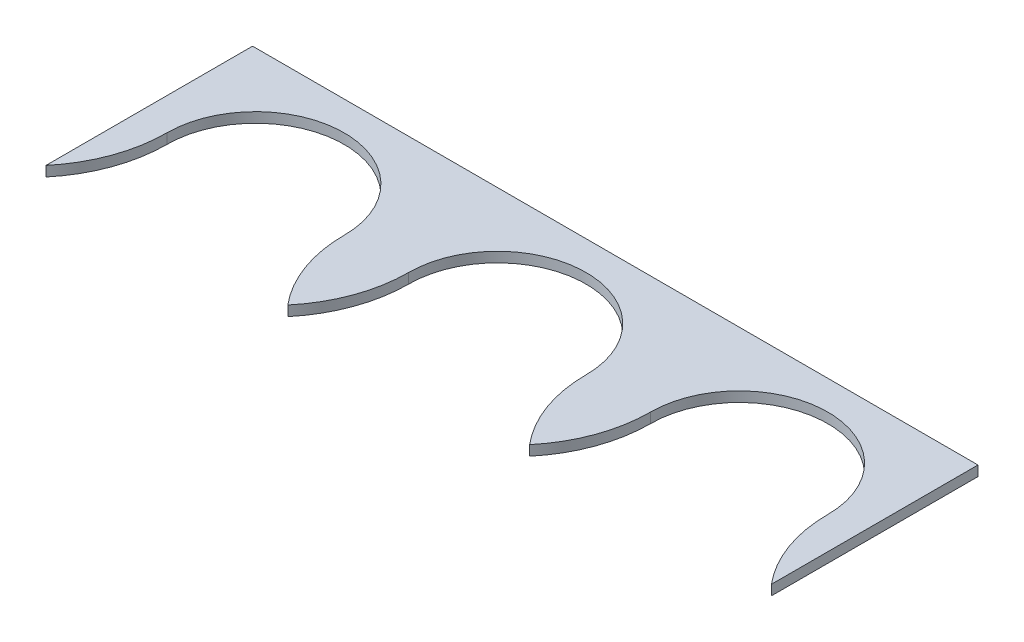
ISO-10303-21;
HEADER;
FILE_DESCRIPTION(('STEP AP214'),'2;1');
FILE_NAME('part.step','',(''),(''),'','','');
FILE_SCHEMA(('AUTOMOTIVE_DESIGN { 1 0 10303 214 1 1 1 1 }'));
ENDSEC;
DATA;
#1=APPLICATION_CONTEXT('core data for automotive mechanical design processes');
#2=APPLICATION_PROTOCOL_DEFINITION('international standard','automotive_design',2000,#1);
#3=PRODUCT_CONTEXT('',#1,'mechanical');
#4=PRODUCT('Part','Part','',(#3));
#5=PRODUCT_RELATED_PRODUCT_CATEGORY('part','',(#4));
#6=PRODUCT_DEFINITION_FORMATION('','',#4);
#7=PRODUCT_DEFINITION_CONTEXT('part definition',#1,'design');
#8=PRODUCT_DEFINITION('design','',#6,#7);
#9=PRODUCT_DEFINITION_SHAPE('','',#8);
#10=(LENGTH_UNIT() NAMED_UNIT(*) SI_UNIT(.MILLI.,.METRE.));
#11=(NAMED_UNIT(*) PLANE_ANGLE_UNIT() SI_UNIT($,.RADIAN.));
#12=(NAMED_UNIT(*) SI_UNIT($,.STERADIAN.) SOLID_ANGLE_UNIT());
#13=UNCERTAINTY_MEASURE_WITH_UNIT(LENGTH_MEASURE(1.E-05),#10,'distance_accuracy_value','');
#14=(GEOMETRIC_REPRESENTATION_CONTEXT(3) GLOBAL_UNCERTAINTY_ASSIGNED_CONTEXT((#13)) GLOBAL_UNIT_ASSIGNED_CONTEXT((#10,
#11,#12)) REPRESENTATION_CONTEXT('',''));
#15=CARTESIAN_POINT('',(0.,0.,0.));
#16=DIRECTION('',(0.,0.,1.));
#17=DIRECTION('',(1.,0.,0.));
#18=AXIS2_PLACEMENT_3D('',#15,#16,#17);
#19=CARTESIAN_POINT('',(76.2,-6.35,74.295));
#20=DIRECTION('',(0.,1.,0.));
#21=DIRECTION('',(0.,0.,1.));
#22=AXIS2_PLACEMENT_3D('',#19,#20,#21);
#23=CYLINDRICAL_SURFACE('',#22,55.88);
#24=CARTESIAN_POINT('',(76.2,0.,74.295));
#25=DIRECTION('',(0.,1.,0.));
#26=DIRECTION('',(0.,0.,1.));
#27=AXIS2_PLACEMENT_3D('',#24,#25,#26);
#28=CIRCLE('',#27,55.88);
#29=CARTESIAN_POINT('',(132.08,0.,74.295));
#30=VERTEX_POINT('',#29);
#31=CARTESIAN_POINT('',(20.32,0.,74.2949999999999));
#32=VERTEX_POINT('',#31);
#33=EDGE_CURVE('E153',#30,#32,#28,.T.);
#34=ORIENTED_EDGE('',*,*,#33,.T.);
#35=DIRECTION('',(0.,1.,0.));
#36=VECTOR('',#35,1.);
#37=CARTESIAN_POINT('',(20.32,-6.35,74.2949999999999));
#38=LINE('',#37,#36);
#39=CARTESIAN_POINT('',(20.32,-6.35,74.2949999999999));
#40=VERTEX_POINT('',#39);
#41=EDGE_CURVE('E11',#40,#32,#38,.T.);
#42=ORIENTED_EDGE('',*,*,#41,.F.);
#43=CARTESIAN_POINT('',(76.2,-6.35,74.295));
#44=DIRECTION('',(0.,1.,0.));
#45=DIRECTION('',(0.,0.,1.));
#46=AXIS2_PLACEMENT_3D('',#43,#44,#45);
#47=CIRCLE('',#46,55.88);
#48=CARTESIAN_POINT('',(132.08,-6.35,74.295));
#49=VERTEX_POINT('',#48);
#50=EDGE_CURVE('E53',#49,#40,#47,.T.);
#51=ORIENTED_EDGE('',*,*,#50,.F.);
#52=DIRECTION('',(0.,1.,0.));
#53=VECTOR('',#52,1.);
#54=CARTESIAN_POINT('',(132.08,-6.35,74.295));
#55=LINE('',#54,#53);
#56=EDGE_CURVE('E38',#49,#30,#55,.T.);
#57=ORIENTED_EDGE('',*,*,#56,.T.);
#58=EDGE_LOOP('',(#34,#42,#51,#57));
#59=FACE_BOUND('',#58,.T.);
#60=ADVANCED_FACE('F35',(#59),#23,.F.);
#61=CARTESIAN_POINT('',(-66.6750000000003,-6.35,74.2949999999999));
#62=DIRECTION('',(0.,1.,0.));
#63=DIRECTION('',(0.,0.,1.));
#64=AXIS2_PLACEMENT_3D('',#61,#62,#63);
#65=CYLINDRICAL_SURFACE('',#64,86.9950000000003);
#66=CARTESIAN_POINT('',(-66.6750000000003,0.,74.2949999999999));
#67=DIRECTION('',(0.,1.,0.));
#68=DIRECTION('',(0.,0.,1.));
#69=AXIS2_PLACEMENT_3D('',#66,#67,#68);
#70=CIRCLE('',#69,86.9950000000003);
#71=CARTESIAN_POINT('',(0.,0.,130.175));
#72=VERTEX_POINT('',#71);
#73=EDGE_CURVE('E181',#72,#32,#70,.T.);
#74=ORIENTED_EDGE('',*,*,#73,.F.);
#75=DIRECTION('',(0.,1.,0.));
#76=VECTOR('',#75,1.);
#77=CARTESIAN_POINT('',(0.,-6.35,130.175));
#78=LINE('',#77,#76);
#79=CARTESIAN_POINT('',(0.,-6.35,130.175));
#80=VERTEX_POINT('',#79);
#81=EDGE_CURVE('E44',#80,#72,#78,.T.);
#82=ORIENTED_EDGE('',*,*,#81,.F.);
#83=CARTESIAN_POINT('',(-66.6750000000003,-6.35,74.2949999999999));
#84=DIRECTION('',(0.,1.,0.));
#85=DIRECTION('',(0.,0.,1.));
#86=AXIS2_PLACEMENT_3D('',#83,#84,#85);
#87=CIRCLE('',#86,86.9950000000003);
#88=EDGE_CURVE('E148',#80,#40,#87,.T.);
#89=ORIENTED_EDGE('',*,*,#88,.T.);
#90=ORIENTED_EDGE('',*,*,#41,.T.);
#91=EDGE_LOOP('',(#74,#82,#89,#90));
#92=FACE_BOUND('',#91,.T.);
#93=ADVANCED_FACE('F216',(#92),#65,.T.);
#94=CARTESIAN_POINT('',(0.,-6.35,65.0875));
#95=DIRECTION('',(-1.,0.,0.));
#96=DIRECTION('',(0.,0.,1.));
#97=AXIS2_PLACEMENT_3D('',#94,#95,#96);
#98=PLANE('',#97);
#99=DIRECTION('',(0.,0.,1.));
#100=VECTOR('',#99,1.);
#101=CARTESIAN_POINT('',(0.,0.,65.0875));
#102=LINE('',#101,#100);
#103=CARTESIAN_POINT('',(0.,0.,0.));
#104=VERTEX_POINT('',#103);
#105=EDGE_CURVE('E135',#104,#72,#102,.T.);
#106=ORIENTED_EDGE('',*,*,#105,.F.);
#107=DIRECTION('',(0.,1.,0.));
#108=VECTOR('',#107,1.);
#109=CARTESIAN_POINT('',(0.,-6.35,0.));
#110=LINE('',#109,#108);
#111=CARTESIAN_POINT('',(0.,-6.35,0.));
#112=VERTEX_POINT('',#111);
#113=EDGE_CURVE('E130',#112,#104,#110,.T.);
#114=ORIENTED_EDGE('',*,*,#113,.F.);
#115=DIRECTION('',(0.,0.,1.));
#116=VECTOR('',#115,1.);
#117=CARTESIAN_POINT('',(0.,-6.35,65.0875));
#118=LINE('',#117,#116);
#119=EDGE_CURVE('E134',#112,#80,#118,.T.);
#120=ORIENTED_EDGE('',*,*,#119,.T.);
#121=ORIENTED_EDGE('',*,*,#81,.T.);
#122=EDGE_LOOP('',(#106,#114,#120,#121));
#123=FACE_BOUND('',#122,.T.);
#124=ADVANCED_FACE('F132',(#123),#98,.T.);
#125=CARTESIAN_POINT('',(-141.293107259257,-6.35,0.));
#126=DIRECTION('',(0.,0.,1.));
#127=DIRECTION('',(1.,0.,0.));
#128=AXIS2_PLACEMENT_3D('',#125,#126,#127);
#129=PLANE('',#128);
#130=DIRECTION('',(1.,0.,0.));
#131=VECTOR('',#130,1.);
#132=CARTESIAN_POINT('',(-141.293107259257,0.,0.));
#133=LINE('',#132,#131);
#134=CARTESIAN_POINT('',(457.2,0.,0.));
#135=VERTEX_POINT('',#134);
#136=EDGE_CURVE('E178',#104,#135,#133,.T.);
#137=ORIENTED_EDGE('',*,*,#136,.T.);
#138=DIRECTION('',(0.,1.,0.));
#139=VECTOR('',#138,1.);
#140=CARTESIAN_POINT('',(457.2,-6.35,0.));
#141=LINE('',#140,#139);
#142=CARTESIAN_POINT('',(457.2,-6.35,0.));
#143=VERTEX_POINT('',#142);
#144=EDGE_CURVE('E138',#143,#135,#141,.T.);
#145=ORIENTED_EDGE('',*,*,#144,.F.);
#146=DIRECTION('',(1.,0.,0.));
#147=VECTOR('',#146,1.);
#148=CARTESIAN_POINT('',(-141.293107259257,-6.35,0.));
#149=LINE('',#148,#147);
#150=EDGE_CURVE('E141',#112,#143,#149,.T.);
#151=ORIENTED_EDGE('',*,*,#150,.F.);
#152=ORIENTED_EDGE('',*,*,#113,.T.);
#153=EDGE_LOOP('',(#137,#145,#151,#152));
#154=FACE_BOUND('',#153,.T.);
#155=ADVANCED_FACE('F142',(#154),#129,.F.);
#156=CARTESIAN_POINT('',(457.2,-6.35,65.0875));
#157=DIRECTION('',(-1.,0.,0.));
#158=DIRECTION('',(0.,0.,1.));
#159=AXIS2_PLACEMENT_3D('',#156,#157,#158);
#160=PLANE('',#159);
#161=DIRECTION('',(0.,0.,1.));
#162=VECTOR('',#161,1.);
#163=CARTESIAN_POINT('',(457.2,0.,65.0875));
#164=LINE('',#163,#162);
#165=CARTESIAN_POINT('',(457.2,0.,130.175));
#166=VERTEX_POINT('',#165);
#167=EDGE_CURVE('E175',#135,#166,#164,.T.);
#168=ORIENTED_EDGE('',*,*,#167,.T.);
#169=DIRECTION('',(0.,1.,0.));
#170=VECTOR('',#169,1.);
#171=CARTESIAN_POINT('',(457.2,-6.35,130.175));
#172=LINE('',#171,#170);
#173=CARTESIAN_POINT('',(457.2,-6.35,130.175));
#174=VERTEX_POINT('',#173);
#175=EDGE_CURVE('E186',#174,#166,#172,.T.);
#176=ORIENTED_EDGE('',*,*,#175,.F.);
#177=DIRECTION('',(0.,0.,1.));
#178=VECTOR('',#177,1.);
#179=CARTESIAN_POINT('',(457.2,-6.35,65.0875));
#180=LINE('',#179,#178);
#181=EDGE_CURVE('E145',#143,#174,#180,.T.);
#182=ORIENTED_EDGE('',*,*,#181,.F.);
#183=ORIENTED_EDGE('',*,*,#144,.T.);
#184=EDGE_LOOP('',(#168,#176,#182,#183));
#185=FACE_BOUND('',#184,.T.);
#186=ADVANCED_FACE('F229',(#185),#160,.F.);
#187=CARTESIAN_POINT('',(523.874999999999,-6.35,74.2950000000002));
#188=DIRECTION('',(0.,1.,0.));
#189=DIRECTION('',(0.,0.,1.));
#190=AXIS2_PLACEMENT_3D('',#187,#188,#189);
#191=CYLINDRICAL_SURFACE('',#190,86.9949999999992);
#192=CARTESIAN_POINT('',(523.874999999999,0.,74.2950000000002));
#193=DIRECTION('',(0.,1.,0.));
#194=DIRECTION('',(0.,0.,1.));
#195=AXIS2_PLACEMENT_3D('',#192,#193,#194);
#196=CIRCLE('',#195,86.9949999999992);
#197=CARTESIAN_POINT('',(436.88,0.,74.2950000000001));
#198=VERTEX_POINT('',#197);
#199=EDGE_CURVE('E172',#198,#166,#196,.T.);
#200=ORIENTED_EDGE('',*,*,#199,.F.);
#201=DIRECTION('',(0.,1.,0.));
#202=VECTOR('',#201,1.);
#203=CARTESIAN_POINT('',(436.88,-6.35,74.2950000000001));
#204=LINE('',#203,#202);
#205=CARTESIAN_POINT('',(436.88,-6.35,74.2950000000001));
#206=VERTEX_POINT('',#205);
#207=EDGE_CURVE('E188',#206,#198,#204,.T.);
#208=ORIENTED_EDGE('',*,*,#207,.F.);
#209=CARTESIAN_POINT('',(523.874999999999,-6.35,74.2950000000002));
#210=DIRECTION('',(0.,1.,0.));
#211=DIRECTION('',(0.,0.,1.));
#212=AXIS2_PLACEMENT_3D('',#209,#210,#211);
#213=CIRCLE('',#212,86.9949999999992);
#214=EDGE_CURVE('E274',#206,#174,#213,.T.);
#215=ORIENTED_EDGE('',*,*,#214,.T.);
#216=ORIENTED_EDGE('',*,*,#175,.T.);
#217=EDGE_LOOP('',(#200,#208,#215,#216));
#218=FACE_BOUND('',#217,.T.);
#219=ADVANCED_FACE('F232',(#218),#191,.T.);
#220=CARTESIAN_POINT('',(381.,-6.35,74.295));
#221=DIRECTION('',(0.,1.,0.));
#222=DIRECTION('',(0.,0.,1.));
#223=AXIS2_PLACEMENT_3D('',#220,#221,#222);
#224=CYLINDRICAL_SURFACE('',#223,55.88);
#225=CARTESIAN_POINT('',(381.,0.,74.295));
#226=DIRECTION('',(0.,1.,0.));
#227=DIRECTION('',(0.,0.,1.));
#228=AXIS2_PLACEMENT_3D('',#225,#226,#227);
#229=CIRCLE('',#228,55.88);
#230=CARTESIAN_POINT('',(325.12,0.,74.2950000000001));
#231=VERTEX_POINT('',#230);
#232=EDGE_CURVE('E170',#198,#231,#229,.T.);
#233=ORIENTED_EDGE('',*,*,#232,.T.);
#234=DIRECTION('',(0.,1.,0.));
#235=VECTOR('',#234,1.);
#236=CARTESIAN_POINT('',(325.12,-6.35,74.2950000000001));
#237=LINE('',#236,#235);
#238=CARTESIAN_POINT('',(325.12,-6.35,74.2950000000001));
#239=VERTEX_POINT('',#238);
#240=EDGE_CURVE('E190',#239,#231,#237,.T.);
#241=ORIENTED_EDGE('',*,*,#240,.F.);
#242=CARTESIAN_POINT('',(381.,-6.35,74.295));
#243=DIRECTION('',(0.,1.,0.));
#244=DIRECTION('',(0.,0.,1.));
#245=AXIS2_PLACEMENT_3D('',#242,#243,#244);
#246=CIRCLE('',#245,55.88);
#247=EDGE_CURVE('E272',#206,#239,#246,.T.);
#248=ORIENTED_EDGE('',*,*,#247,.F.);
#249=ORIENTED_EDGE('',*,*,#207,.T.);
#250=EDGE_LOOP('',(#233,#241,#248,#249));
#251=FACE_BOUND('',#250,.T.);
#252=ADVANCED_FACE('F236',(#251),#224,.F.);
#253=CARTESIAN_POINT('',(238.125000000001,-6.35,74.2950000000002));
#254=DIRECTION('',(0.,1.,0.));
#255=DIRECTION('',(0.,0.,1.));
#256=AXIS2_PLACEMENT_3D('',#253,#254,#255);
#257=CYLINDRICAL_SURFACE('',#256,86.9949999999994);
#258=CARTESIAN_POINT('',(238.125000000001,0.,74.2950000000002));
#259=DIRECTION('',(0.,1.,0.));
#260=DIRECTION('',(0.,0.,1.));
#261=AXIS2_PLACEMENT_3D('',#258,#259,#260);
#262=CIRCLE('',#261,86.9949999999994);
#263=CARTESIAN_POINT('',(304.8,0.,130.175));
#264=VERTEX_POINT('',#263);
#265=EDGE_CURVE('E167',#231,#264,#262,.F.);
#266=ORIENTED_EDGE('',*,*,#265,.T.);
#267=DIRECTION('',(0.,1.,0.));
#268=VECTOR('',#267,1.);
#269=CARTESIAN_POINT('',(304.8,-6.35,130.175));
#270=LINE('',#269,#268);
#271=CARTESIAN_POINT('',(304.8,-6.35,130.175));
#272=VERTEX_POINT('',#271);
#273=EDGE_CURVE('E193',#272,#264,#270,.T.);
#274=ORIENTED_EDGE('',*,*,#273,.F.);
#275=CARTESIAN_POINT('',(238.125000000001,-6.35,74.2950000000002));
#276=DIRECTION('',(0.,1.,0.));
#277=DIRECTION('',(0.,0.,1.));
#278=AXIS2_PLACEMENT_3D('',#275,#276,#277);
#279=CIRCLE('',#278,86.9949999999994);
#280=EDGE_CURVE('E270',#239,#272,#279,.F.);
#281=ORIENTED_EDGE('',*,*,#280,.F.);
#282=ORIENTED_EDGE('',*,*,#240,.T.);
#283=EDGE_LOOP('',(#266,#274,#281,#282));
#284=FACE_BOUND('',#283,.T.);
#285=ADVANCED_FACE('F240',(#284),#257,.T.);
#286=CARTESIAN_POINT('',(371.475,-6.35,74.2950000000002));
#287=DIRECTION('',(0.,1.,0.));
#288=DIRECTION('',(0.,0.,1.));
#289=AXIS2_PLACEMENT_3D('',#286,#287,#288);
#290=CYLINDRICAL_SURFACE('',#289,86.9949999999995);
#291=CARTESIAN_POINT('',(371.475,0.,74.2950000000002));
#292=DIRECTION('',(0.,1.,0.));
#293=DIRECTION('',(0.,0.,1.));
#294=AXIS2_PLACEMENT_3D('',#291,#292,#293);
#295=CIRCLE('',#294,86.9949999999995);
#296=CARTESIAN_POINT('',(284.48,0.,74.2950000000001));
#297=VERTEX_POINT('',#296);
#298=EDGE_CURVE('E164',#297,#264,#295,.T.);
#299=ORIENTED_EDGE('',*,*,#298,.F.);
#300=DIRECTION('',(0.,1.,0.));
#301=VECTOR('',#300,1.);
#302=CARTESIAN_POINT('',(284.48,-6.35,74.2950000000001));
#303=LINE('',#302,#301);
#304=CARTESIAN_POINT('',(284.48,-6.35,74.2950000000001));
#305=VERTEX_POINT('',#304);
#306=EDGE_CURVE('E195',#305,#297,#303,.T.);
#307=ORIENTED_EDGE('',*,*,#306,.F.);
#308=CARTESIAN_POINT('',(371.475,-6.35,74.2950000000002));
#309=DIRECTION('',(0.,1.,0.));
#310=DIRECTION('',(0.,0.,1.));
#311=AXIS2_PLACEMENT_3D('',#308,#309,#310);
#312=CIRCLE('',#311,86.9949999999995);
#313=EDGE_CURVE('E263',#305,#272,#312,.T.);
#314=ORIENTED_EDGE('',*,*,#313,.T.);
#315=ORIENTED_EDGE('',*,*,#273,.T.);
#316=EDGE_LOOP('',(#299,#307,#314,#315));
#317=FACE_BOUND('',#316,.T.);
#318=ADVANCED_FACE('F244',(#317),#290,.T.);
#319=CARTESIAN_POINT('',(228.6,-6.35,74.295));
#320=DIRECTION('',(0.,1.,0.));
#321=DIRECTION('',(0.,0.,1.));
#322=AXIS2_PLACEMENT_3D('',#319,#320,#321);
#323=CYLINDRICAL_SURFACE('',#322,55.88);
#324=CARTESIAN_POINT('',(228.6,0.,74.295));
#325=DIRECTION('',(0.,1.,0.));
#326=DIRECTION('',(0.,0.,1.));
#327=AXIS2_PLACEMENT_3D('',#324,#325,#326);
#328=CIRCLE('',#327,55.88);
#329=CARTESIAN_POINT('',(172.72,0.,74.2949999999999));
#330=VERTEX_POINT('',#329);
#331=EDGE_CURVE('E161',#297,#330,#328,.T.);
#332=ORIENTED_EDGE('',*,*,#331,.T.);
#333=DIRECTION('',(0.,1.,0.));
#334=VECTOR('',#333,1.);
#335=CARTESIAN_POINT('',(172.72,-6.35,74.2949999999999));
#336=LINE('',#335,#334);
#337=CARTESIAN_POINT('',(172.72,-6.35,74.2949999999999));
#338=VERTEX_POINT('',#337);
#339=EDGE_CURVE('E197',#338,#330,#336,.T.);
#340=ORIENTED_EDGE('',*,*,#339,.F.);
#341=CARTESIAN_POINT('',(228.6,-6.35,74.295));
#342=DIRECTION('',(0.,1.,0.));
#343=DIRECTION('',(0.,0.,1.));
#344=AXIS2_PLACEMENT_3D('',#341,#342,#343);
#345=CIRCLE('',#344,55.88);
#346=EDGE_CURVE('E260',#305,#338,#345,.T.);
#347=ORIENTED_EDGE('',*,*,#346,.F.);
#348=ORIENTED_EDGE('',*,*,#306,.T.);
#349=EDGE_LOOP('',(#332,#340,#347,#348));
#350=FACE_BOUND('',#349,.T.);
#351=ADVANCED_FACE('F212',(#350),#323,.F.);
#352=CARTESIAN_POINT('',(85.7249999999997,-6.35,74.2949999999999));
#353=DIRECTION('',(0.,1.,0.));
#354=DIRECTION('',(0.,0.,1.));
#355=AXIS2_PLACEMENT_3D('',#352,#353,#354);
#356=CYLINDRICAL_SURFACE('',#355,86.9950000000003);
#357=CARTESIAN_POINT('',(85.7249999999997,0.,74.2949999999999));
#358=DIRECTION('',(0.,1.,0.));
#359=DIRECTION('',(0.,0.,1.));
#360=AXIS2_PLACEMENT_3D('',#357,#358,#359);
#361=CIRCLE('',#360,86.9950000000003);
#362=CARTESIAN_POINT('',(152.4,0.,130.175));
#363=VERTEX_POINT('',#362);
#364=EDGE_CURVE('E158',#363,#330,#361,.T.);
#365=ORIENTED_EDGE('',*,*,#364,.F.);
#366=DIRECTION('',(0.,1.,0.));
#367=VECTOR('',#366,1.);
#368=CARTESIAN_POINT('',(152.4,-6.35,130.175));
#369=LINE('',#368,#367);
#370=CARTESIAN_POINT('',(152.4,-6.35,130.175));
#371=VERTEX_POINT('',#370);
#372=EDGE_CURVE('E198',#371,#363,#369,.T.);
#373=ORIENTED_EDGE('',*,*,#372,.F.);
#374=CARTESIAN_POINT('',(85.7249999999997,-6.35,74.2949999999999));
#375=DIRECTION('',(0.,1.,0.));
#376=DIRECTION('',(0.,0.,1.));
#377=AXIS2_PLACEMENT_3D('',#374,#375,#376);
#378=CIRCLE('',#377,86.9950000000003);
#379=EDGE_CURVE('E259',#371,#338,#378,.T.);
#380=ORIENTED_EDGE('',*,*,#379,.T.);
#381=ORIENTED_EDGE('',*,*,#339,.T.);
#382=EDGE_LOOP('',(#365,#373,#380,#381));
#383=FACE_BOUND('',#382,.T.);
#384=ADVANCED_FACE('F206',(#383),#356,.T.);
#385=CARTESIAN_POINT('',(219.075,-6.35,74.2949999999999));
#386=DIRECTION('',(0.,1.,0.));
#387=DIRECTION('',(0.,0.,1.));
#388=AXIS2_PLACEMENT_3D('',#385,#386,#387);
#389=CYLINDRICAL_SURFACE('',#388,86.9950000000003);
#390=CARTESIAN_POINT('',(219.075,0.,74.2949999999999));
#391=DIRECTION('',(0.,1.,0.));
#392=DIRECTION('',(0.,0.,1.));
#393=AXIS2_PLACEMENT_3D('',#390,#391,#392);
#394=CIRCLE('',#393,86.9950000000003);
#395=EDGE_CURVE('E155',#30,#363,#394,.T.);
#396=ORIENTED_EDGE('',*,*,#395,.F.);
#397=ORIENTED_EDGE('',*,*,#56,.F.);
#398=CARTESIAN_POINT('',(219.075,-6.35,74.2949999999999));
#399=DIRECTION('',(0.,1.,0.));
#400=DIRECTION('',(0.,0.,1.));
#401=AXIS2_PLACEMENT_3D('',#398,#399,#400);
#402=CIRCLE('',#401,86.9950000000003);
#403=EDGE_CURVE('E261',#49,#371,#402,.T.);
#404=ORIENTED_EDGE('',*,*,#403,.T.);
#405=ORIENTED_EDGE('',*,*,#372,.T.);
#406=EDGE_LOOP('',(#396,#397,#404,#405));
#407=FACE_BOUND('',#406,.T.);
#408=ADVANCED_FACE('F204',(#407),#389,.T.);
#409=CARTESIAN_POINT('',(-141.293107259257,-6.35,65.0875));
#410=DIRECTION('',(0.,1.,0.));
#411=DIRECTION('',(0.,0.,1.));
#412=AXIS2_PLACEMENT_3D('',#409,#410,#411);
#413=PLANE('',#412);
#414=ORIENTED_EDGE('',*,*,#50,.T.);
#415=ORIENTED_EDGE('',*,*,#88,.F.);
#416=ORIENTED_EDGE('',*,*,#119,.F.);
#417=ORIENTED_EDGE('',*,*,#150,.T.);
#418=ORIENTED_EDGE('',*,*,#181,.T.);
#419=ORIENTED_EDGE('',*,*,#214,.F.);
#420=ORIENTED_EDGE('',*,*,#247,.T.);
#421=ORIENTED_EDGE('',*,*,#280,.T.);
#422=ORIENTED_EDGE('',*,*,#313,.F.);
#423=ORIENTED_EDGE('',*,*,#346,.T.);
#424=ORIENTED_EDGE('',*,*,#379,.F.);
#425=ORIENTED_EDGE('',*,*,#403,.F.);
#426=EDGE_LOOP('',(#414,#415,#416,#417,#418,#419,#420,#421,#422,#423,#424,#425));
#427=FACE_BOUND('',#426,.T.);
#428=ADVANCED_FACE('F147',(#427),#413,.F.);
#429=CARTESIAN_POINT('',(-141.293107259257,0.,65.0875));
#430=DIRECTION('',(0.,1.,0.));
#431=DIRECTION('',(0.,0.,1.));
#432=AXIS2_PLACEMENT_3D('',#429,#430,#431);
#433=PLANE('',#432);
#434=ORIENTED_EDGE('',*,*,#33,.F.);
#435=ORIENTED_EDGE('',*,*,#395,.T.);
#436=ORIENTED_EDGE('',*,*,#364,.T.);
#437=ORIENTED_EDGE('',*,*,#331,.F.);
#438=ORIENTED_EDGE('',*,*,#298,.T.);
#439=ORIENTED_EDGE('',*,*,#265,.F.);
#440=ORIENTED_EDGE('',*,*,#232,.F.);
#441=ORIENTED_EDGE('',*,*,#199,.T.);
#442=ORIENTED_EDGE('',*,*,#167,.F.);
#443=ORIENTED_EDGE('',*,*,#136,.F.);
#444=ORIENTED_EDGE('',*,*,#105,.T.);
#445=ORIENTED_EDGE('',*,*,#73,.T.);
#446=EDGE_LOOP('',(#434,#435,#436,#437,#438,#439,#440,#441,#442,#443,#444,#445));
#447=FACE_BOUND('',#446,.T.);
#448=ADVANCED_FACE('F203',(#447),#433,.T.);
#449=CLOSED_SHELL('',(#60,#93,#124,#155,#186,#219,#252,#285,#318,#351,#384,#408,#428,#448));
#450=MANIFOLD_SOLID_BREP('B2',#449);
#451=ADVANCED_BREP_SHAPE_REPRESENTATION('',(#18,#450),#14);
#452=SHAPE_DEFINITION_REPRESENTATION(#9,#451);
ENDSEC;
END-ISO-10303-21;
